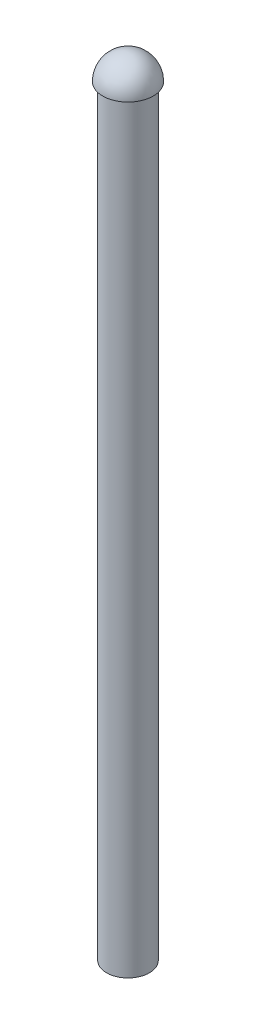
ISO-10303-21;
HEADER;
FILE_DESCRIPTION(('STEP AP214'),'2;1');
FILE_NAME('part.step','',(''),(''),'','','');
FILE_SCHEMA(('AUTOMOTIVE_DESIGN { 1 0 10303 214 1 1 1 1 }'));
ENDSEC;
DATA;
#1=APPLICATION_CONTEXT('core data for automotive mechanical design processes');
#2=APPLICATION_PROTOCOL_DEFINITION('international standard','automotive_design',2000,#1);
#3=PRODUCT_CONTEXT('',#1,'mechanical');
#4=PRODUCT('Part','Part','',(#3));
#5=PRODUCT_RELATED_PRODUCT_CATEGORY('part','',(#4));
#6=PRODUCT_DEFINITION_FORMATION('','',#4);
#7=PRODUCT_DEFINITION_CONTEXT('part definition',#1,'design');
#8=PRODUCT_DEFINITION('design','',#6,#7);
#9=PRODUCT_DEFINITION_SHAPE('','',#8);
#10=(LENGTH_UNIT() NAMED_UNIT(*) SI_UNIT(.MILLI.,.METRE.));
#11=(NAMED_UNIT(*) PLANE_ANGLE_UNIT() SI_UNIT($,.RADIAN.));
#12=(NAMED_UNIT(*) SI_UNIT($,.STERADIAN.) SOLID_ANGLE_UNIT());
#13=UNCERTAINTY_MEASURE_WITH_UNIT(LENGTH_MEASURE(1.E-05),#10,'distance_accuracy_value','');
#14=(GEOMETRIC_REPRESENTATION_CONTEXT(3) GLOBAL_UNCERTAINTY_ASSIGNED_CONTEXT((#13)) GLOBAL_UNIT_ASSIGNED_CONTEXT((#10,
#11,#12)) REPRESENTATION_CONTEXT('',''));
#15=CARTESIAN_POINT('',(0.,0.,0.));
#16=DIRECTION('',(0.,0.,1.));
#17=DIRECTION('',(1.,0.,0.));
#18=AXIS2_PLACEMENT_3D('',#15,#16,#17);
#19=CARTESIAN_POINT('',(0.,25.4,0.));
#20=DIRECTION('',(0.,-1.,0.));
#21=DIRECTION('',(0.,0.,-1.));
#22=AXIS2_PLACEMENT_3D('',#19,#20,#21);
#23=CYLINDRICAL_SURFACE('',#22,0.714375);
#24=CARTESIAN_POINT('',(0.,25.4,0.));
#25=DIRECTION('',(0.,1.,0.));
#26=DIRECTION('',(0.,0.,1.));
#27=AXIS2_PLACEMENT_3D('',#24,#25,#26);
#28=CIRCLE('',#27,0.714375);
#29=CARTESIAN_POINT('',(0.,25.4,0.714375));
#30=VERTEX_POINT('',#29);
#31=EDGE_CURVE('E12',#30,#30,#28,.T.);
#32=ORIENTED_EDGE('',*,*,#31,.F.);
#33=EDGE_LOOP('',(#32));
#34=FACE_BOUND('',#33,.T.);
#35=CARTESIAN_POINT('',(0.,0.,0.));
#36=DIRECTION('',(0.,1.,0.));
#37=DIRECTION('',(0.,0.,1.));
#38=AXIS2_PLACEMENT_3D('',#35,#36,#37);
#39=CIRCLE('',#38,0.714375);
#40=CARTESIAN_POINT('',(0.,0.,0.714375));
#41=VERTEX_POINT('',#40);
#42=EDGE_CURVE('E49',#41,#41,#39,.T.);
#43=ORIENTED_EDGE('',*,*,#42,.T.);
#44=EDGE_LOOP('',(#43));
#45=FACE_BOUND('',#44,.T.);
#46=ADVANCED_FACE('F46',(#34,#45),#23,.T.);
#47=CARTESIAN_POINT('',(0.,0.,0.));
#48=DIRECTION('',(0.,1.,0.));
#49=DIRECTION('',(0.,0.,1.));
#50=AXIS2_PLACEMENT_3D('',#47,#48,#49);
#51=PLANE('',#50);
#52=ORIENTED_EDGE('',*,*,#42,.F.);
#53=EDGE_LOOP('',(#52));
#54=FACE_BOUND('',#53,.T.);
#55=ADVANCED_FACE('F65',(#54),#51,.F.);
#56=CARTESIAN_POINT('',(0.,25.4,0.));
#57=DIRECTION('',(0.0193067455225448,0.,0.999813607417566));
#58=DIRECTION('',(0.999813607417566,0.,-0.0193067455225448));
#59=AXIS2_PLACEMENT_3D('',#56,#57,#58);
#60=SPHERICAL_SURFACE('',#59,0.841375);
#61=CARTESIAN_POINT('',(0.,25.4,0.));
#62=DIRECTION('',(0.,-1.,0.));
#63=DIRECTION('',(0.0386062937767769,0.,0.999254499154655));
#64=AXIS2_PLACEMENT_3D('',#61,#62,#63);
#65=SPHERICAL_SURFACE('',#64,0.841375);
#66=CARTESIAN_POINT('',(0.,25.4,0.));
#67=DIRECTION('',(0.,-1.,0.));
#68=DIRECTION('',(0.0386062937767769,0.,0.999254499154656));
#69=AXIS2_PLACEMENT_3D('',#66,#67,#68);
#70=CIRCLE('',#69,0.841375);
#71=CARTESIAN_POINT('',(0.0324823704264357,25.4,0.84074775422625));
#72=VERTEX_POINT('',#71);
#73=EDGE_CURVE('E56',#72,#72,#70,.T.);
#74=ORIENTED_EDGE('',*,*,#73,.F.);
#75=EDGE_LOOP('',(#74));
#76=FACE_BOUND('',#75,.T.);
#77=ADVANCED_FACE('F63',(#76),#65,.T.);
#78=CARTESIAN_POINT('',(0.,25.4,0.));
#79=DIRECTION('',(0.,-1.,0.));
#80=DIRECTION('',(0.0386062937767769,0.,0.999254499154656));
#81=AXIS2_PLACEMENT_3D('',#78,#79,#80);
#82=PLANE('',#81);
#83=ORIENTED_EDGE('',*,*,#31,.T.);
#84=EDGE_LOOP('',(#83));
#85=FACE_BOUND('',#84,.T.);
#86=ORIENTED_EDGE('',*,*,#73,.T.);
#87=EDGE_LOOP('',(#86));
#88=FACE_BOUND('',#87,.T.);
#89=ADVANCED_FACE('F61',(#85,#88),#82,.T.);
#90=CLOSED_SHELL('',(#46,#55,#77,#89));
#91=MANIFOLD_SOLID_BREP('B2',#90);
#92=ADVANCED_BREP_SHAPE_REPRESENTATION('',(#18,#91),#14);
#93=SHAPE_DEFINITION_REPRESENTATION(#9,#92);
ENDSEC;
END-ISO-10303-21;
